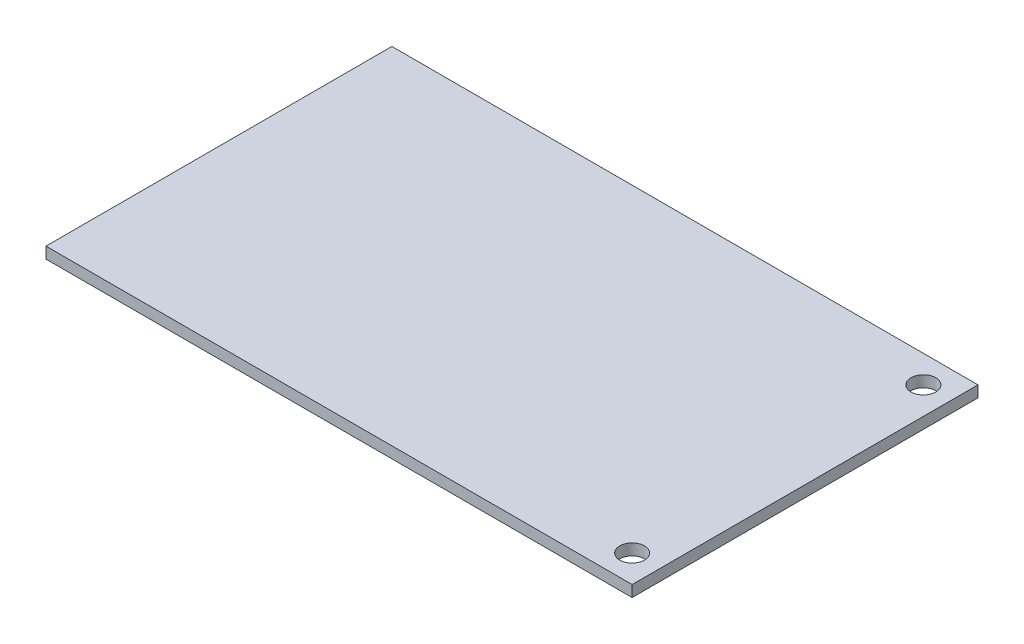
ISO-10303-21;
HEADER;
FILE_DESCRIPTION(('STEP AP214'),'2;1');
FILE_NAME('part.step','',(''),(''),'','','');
FILE_SCHEMA(('AUTOMOTIVE_DESIGN { 1 0 10303 214 1 1 1 1 }'));
ENDSEC;
DATA;
#1=APPLICATION_CONTEXT('core data for automotive mechanical design processes');
#2=APPLICATION_PROTOCOL_DEFINITION('international standard','automotive_design',2000,#1);
#3=PRODUCT_CONTEXT('',#1,'mechanical');
#4=PRODUCT('Part','Part','',(#3));
#5=PRODUCT_RELATED_PRODUCT_CATEGORY('part','',(#4));
#6=PRODUCT_DEFINITION_FORMATION('','',#4);
#7=PRODUCT_DEFINITION_CONTEXT('part definition',#1,'design');
#8=PRODUCT_DEFINITION('design','',#6,#7);
#9=PRODUCT_DEFINITION_SHAPE('','',#8);
#10=(LENGTH_UNIT() NAMED_UNIT(*) SI_UNIT(.MILLI.,.METRE.));
#11=(NAMED_UNIT(*) PLANE_ANGLE_UNIT() SI_UNIT($,.RADIAN.));
#12=(NAMED_UNIT(*) SI_UNIT($,.STERADIAN.) SOLID_ANGLE_UNIT());
#13=UNCERTAINTY_MEASURE_WITH_UNIT(LENGTH_MEASURE(1.E-05),#10,'distance_accuracy_value','');
#14=(GEOMETRIC_REPRESENTATION_CONTEXT(3) GLOBAL_UNCERTAINTY_ASSIGNED_CONTEXT((#13)) GLOBAL_UNIT_ASSIGNED_CONTEXT((#10,
#11,#12)) REPRESENTATION_CONTEXT('',''));
#15=CARTESIAN_POINT('',(0.,0.,0.));
#16=DIRECTION('',(0.,0.,1.));
#17=DIRECTION('',(1.,0.,0.));
#18=AXIS2_PLACEMENT_3D('',#15,#16,#17);
#19=CARTESIAN_POINT('',(0.,1.5748,0.));
#20=DIRECTION('',(0.,1.,0.));
#21=DIRECTION('',(0.,0.,1.));
#22=AXIS2_PLACEMENT_3D('',#19,#20,#21);
#23=PLANE('',#22);
#24=CARTESIAN_POINT('',(37.084,1.5748,-20.32));
#25=DIRECTION('',(0.,1.,0.));
#26=DIRECTION('',(0.,0.,1.));
#27=AXIS2_PLACEMENT_3D('',#24,#25,#26);
#28=CIRCLE('',#27,1.7272);
#29=CARTESIAN_POINT('',(37.084,1.5748,-18.5928));
#30=VERTEX_POINT('',#29);
#31=EDGE_CURVE('E100',#30,#30,#28,.T.);
#32=ORIENTED_EDGE('',*,*,#31,.F.);
#33=EDGE_LOOP('',(#32));
#34=FACE_BOUND('',#33,.T.);
#35=DIRECTION('',(0.,0.,1.));
#36=VECTOR('',#35,1.);
#37=CARTESIAN_POINT('',(-40.894,1.5748,24.13));
#38=LINE('',#37,#36);
#39=CARTESIAN_POINT('',(-40.894,1.5748,-24.13));
#40=VERTEX_POINT('',#39);
#41=CARTESIAN_POINT('',(-40.894,1.5748,24.13));
#42=VERTEX_POINT('',#41);
#43=EDGE_CURVE('E85',#40,#42,#38,.T.);
#44=ORIENTED_EDGE('',*,*,#43,.T.);
#45=DIRECTION('',(1.,0.,0.));
#46=VECTOR('',#45,1.);
#47=CARTESIAN_POINT('',(40.894,1.5748,24.13));
#48=LINE('',#47,#46);
#49=CARTESIAN_POINT('',(40.894,1.5748,24.13));
#50=VERTEX_POINT('',#49);
#51=EDGE_CURVE('E80',#42,#50,#48,.T.);
#52=ORIENTED_EDGE('',*,*,#51,.T.);
#53=DIRECTION('',(0.,0.,-1.));
#54=VECTOR('',#53,1.);
#55=CARTESIAN_POINT('',(40.894,1.5748,24.13));
#56=LINE('',#55,#54);
#57=CARTESIAN_POINT('',(40.894,1.5748,-24.13));
#58=VERTEX_POINT('',#57);
#59=EDGE_CURVE('E83',#50,#58,#56,.T.);
#60=ORIENTED_EDGE('',*,*,#59,.T.);
#61=DIRECTION('',(-1.,0.,0.));
#62=VECTOR('',#61,1.);
#63=CARTESIAN_POINT('',(40.894,1.5748,-24.13));
#64=LINE('',#63,#62);
#65=EDGE_CURVE('E50',#58,#40,#64,.T.);
#66=ORIENTED_EDGE('',*,*,#65,.T.);
#67=EDGE_LOOP('',(#44,#52,#60,#66));
#68=FACE_BOUND('',#67,.T.);
#69=CARTESIAN_POINT('',(37.084,1.5748,20.32));
#70=DIRECTION('',(0.,1.,0.));
#71=DIRECTION('',(0.,0.,-1.));
#72=AXIS2_PLACEMENT_3D('',#69,#70,#71);
#73=CIRCLE('',#72,1.7272);
#74=CARTESIAN_POINT('',(37.084,1.5748,18.5928));
#75=VERTEX_POINT('',#74);
#76=EDGE_CURVE('E115',#75,#75,#73,.T.);
#77=ORIENTED_EDGE('',*,*,#76,.F.);
#78=EDGE_LOOP('',(#77));
#79=FACE_BOUND('',#78,.T.);
#80=ADVANCED_FACE('F33',(#34,#68,#79),#23,.T.);
#81=CARTESIAN_POINT('',(0.,0.,0.));
#82=DIRECTION('',(0.,1.,0.));
#83=DIRECTION('',(0.,0.,1.));
#84=AXIS2_PLACEMENT_3D('',#81,#82,#83);
#85=PLANE('',#84);
#86=DIRECTION('',(0.,0.,1.));
#87=VECTOR('',#86,1.);
#88=CARTESIAN_POINT('',(-40.894,0.,24.13));
#89=LINE('',#88,#87);
#90=CARTESIAN_POINT('',(-40.894,0.,-24.13));
#91=VERTEX_POINT('',#90);
#92=CARTESIAN_POINT('',(-40.894,0.,24.13));
#93=VERTEX_POINT('',#92);
#94=EDGE_CURVE('E97',#91,#93,#89,.T.);
#95=ORIENTED_EDGE('',*,*,#94,.F.);
#96=DIRECTION('',(-1.,0.,0.));
#97=VECTOR('',#96,1.);
#98=CARTESIAN_POINT('',(40.894,0.,-24.13));
#99=LINE('',#98,#97);
#100=CARTESIAN_POINT('',(40.894,0.,-24.13));
#101=VERTEX_POINT('',#100);
#102=EDGE_CURVE('E73',#101,#91,#99,.T.);
#103=ORIENTED_EDGE('',*,*,#102,.F.);
#104=DIRECTION('',(0.,0.,-1.));
#105=VECTOR('',#104,1.);
#106=CARTESIAN_POINT('',(40.894,0.,24.13));
#107=LINE('',#106,#105);
#108=CARTESIAN_POINT('',(40.894,0.,24.13));
#109=VERTEX_POINT('',#108);
#110=EDGE_CURVE('E67',#109,#101,#107,.T.);
#111=ORIENTED_EDGE('',*,*,#110,.F.);
#112=DIRECTION('',(1.,0.,0.));
#113=VECTOR('',#112,1.);
#114=CARTESIAN_POINT('',(40.894,0.,24.13));
#115=LINE('',#114,#113);
#116=EDGE_CURVE('E89',#93,#109,#115,.T.);
#117=ORIENTED_EDGE('',*,*,#116,.F.);
#118=EDGE_LOOP('',(#95,#103,#111,#117));
#119=FACE_BOUND('',#118,.T.);
#120=CARTESIAN_POINT('',(37.084,0.,-20.32));
#121=DIRECTION('',(0.,1.,0.));
#122=DIRECTION('',(0.,0.,1.));
#123=AXIS2_PLACEMENT_3D('',#120,#121,#122);
#124=CIRCLE('',#123,1.7272);
#125=CARTESIAN_POINT('',(37.084,0.,-18.5928));
#126=VERTEX_POINT('',#125);
#127=EDGE_CURVE('E112',#126,#126,#124,.T.);
#128=ORIENTED_EDGE('',*,*,#127,.T.);
#129=EDGE_LOOP('',(#128));
#130=FACE_BOUND('',#129,.T.);
#131=CARTESIAN_POINT('',(37.084,0.,20.32));
#132=DIRECTION('',(0.,1.,0.));
#133=DIRECTION('',(0.,0.,-1.));
#134=AXIS2_PLACEMENT_3D('',#131,#132,#133);
#135=CIRCLE('',#134,1.7272);
#136=CARTESIAN_POINT('',(37.084,0.,18.5928));
#137=VERTEX_POINT('',#136);
#138=EDGE_CURVE('E118',#137,#137,#135,.T.);
#139=ORIENTED_EDGE('',*,*,#138,.T.);
#140=EDGE_LOOP('',(#139));
#141=FACE_BOUND('',#140,.T.);
#142=ADVANCED_FACE('F108',(#119,#130,#141),#85,.F.);
#143=CARTESIAN_POINT('',(-40.894,1.5748,24.13));
#144=DIRECTION('',(1.,0.,0.));
#145=DIRECTION('',(0.,0.,-1.));
#146=AXIS2_PLACEMENT_3D('',#143,#144,#145);
#147=PLANE('',#146);
#148=ORIENTED_EDGE('',*,*,#94,.T.);
#149=DIRECTION('',(0.,-1.,0.));
#150=VECTOR('',#149,1.);
#151=CARTESIAN_POINT('',(-40.894,1.5748,24.13));
#152=LINE('',#151,#150);
#153=EDGE_CURVE('E11',#42,#93,#152,.T.);
#154=ORIENTED_EDGE('',*,*,#153,.F.);
#155=ORIENTED_EDGE('',*,*,#43,.F.);
#156=DIRECTION('',(0.,-1.,0.));
#157=VECTOR('',#156,1.);
#158=CARTESIAN_POINT('',(-40.894,1.5748,-24.13));
#159=LINE('',#158,#157);
#160=EDGE_CURVE('E93',#40,#91,#159,.T.);
#161=ORIENTED_EDGE('',*,*,#160,.T.);
#162=EDGE_LOOP('',(#148,#154,#155,#161));
#163=FACE_BOUND('',#162,.T.);
#164=ADVANCED_FACE('F35',(#163),#147,.F.);
#165=CARTESIAN_POINT('',(40.894,1.5748,24.13));
#166=DIRECTION('',(0.,0.,-1.));
#167=DIRECTION('',(-1.,0.,0.));
#168=AXIS2_PLACEMENT_3D('',#165,#166,#167);
#169=PLANE('',#168);
#170=ORIENTED_EDGE('',*,*,#116,.T.);
#171=DIRECTION('',(0.,-1.,0.));
#172=VECTOR('',#171,1.);
#173=CARTESIAN_POINT('',(40.894,1.5748,24.13));
#174=LINE('',#173,#172);
#175=EDGE_CURVE('E42',#50,#109,#174,.T.);
#176=ORIENTED_EDGE('',*,*,#175,.F.);
#177=ORIENTED_EDGE('',*,*,#51,.F.);
#178=ORIENTED_EDGE('',*,*,#153,.T.);
#179=EDGE_LOOP('',(#170,#176,#177,#178));
#180=FACE_BOUND('',#179,.T.);
#181=ADVANCED_FACE('F88',(#180),#169,.F.);
#182=CARTESIAN_POINT('',(40.894,1.5748,24.13));
#183=DIRECTION('',(-1.,0.,0.));
#184=DIRECTION('',(0.,0.,1.));
#185=AXIS2_PLACEMENT_3D('',#182,#183,#184);
#186=PLANE('',#185);
#187=ORIENTED_EDGE('',*,*,#110,.T.);
#188=DIRECTION('',(0.,-1.,0.));
#189=VECTOR('',#188,1.);
#190=CARTESIAN_POINT('',(40.894,1.5748,-24.13));
#191=LINE('',#190,#189);
#192=EDGE_CURVE('E90',#58,#101,#191,.T.);
#193=ORIENTED_EDGE('',*,*,#192,.F.);
#194=ORIENTED_EDGE('',*,*,#59,.F.);
#195=ORIENTED_EDGE('',*,*,#175,.T.);
#196=EDGE_LOOP('',(#187,#193,#194,#195));
#197=FACE_BOUND('',#196,.T.);
#198=ADVANCED_FACE('F91',(#197),#186,.F.);
#199=CARTESIAN_POINT('',(40.894,1.5748,-24.13));
#200=DIRECTION('',(0.,0.,1.));
#201=DIRECTION('',(1.,0.,0.));
#202=AXIS2_PLACEMENT_3D('',#199,#200,#201);
#203=PLANE('',#202);
#204=ORIENTED_EDGE('',*,*,#102,.T.);
#205=ORIENTED_EDGE('',*,*,#160,.F.);
#206=ORIENTED_EDGE('',*,*,#65,.F.);
#207=ORIENTED_EDGE('',*,*,#192,.T.);
#208=EDGE_LOOP('',(#204,#205,#206,#207));
#209=FACE_BOUND('',#208,.T.);
#210=ADVANCED_FACE('F105',(#209),#203,.F.);
#211=CARTESIAN_POINT('',(37.084,1.5748,-20.32));
#212=DIRECTION('',(0.,-1.,0.));
#213=DIRECTION('',(0.,0.,-1.));
#214=AXIS2_PLACEMENT_3D('',#211,#212,#213);
#215=CYLINDRICAL_SURFACE('',#214,1.7272);
#216=ORIENTED_EDGE('',*,*,#31,.T.);
#217=EDGE_LOOP('',(#216));
#218=FACE_BOUND('',#217,.T.);
#219=ORIENTED_EDGE('',*,*,#127,.F.);
#220=EDGE_LOOP('',(#219));
#221=FACE_BOUND('',#220,.T.);
#222=ADVANCED_FACE('F135',(#218,#221),#215,.F.);
#223=CARTESIAN_POINT('',(37.084,1.5748,20.32));
#224=DIRECTION('',(0.,-1.,0.));
#225=DIRECTION('',(0.,0.,-1.));
#226=AXIS2_PLACEMENT_3D('',#223,#224,#225);
#227=CYLINDRICAL_SURFACE('',#226,1.7272);
#228=ORIENTED_EDGE('',*,*,#76,.T.);
#229=EDGE_LOOP('',(#228));
#230=FACE_BOUND('',#229,.T.);
#231=ORIENTED_EDGE('',*,*,#138,.F.);
#232=EDGE_LOOP('',(#231));
#233=FACE_BOUND('',#232,.T.);
#234=ADVANCED_FACE('F124',(#230,#233),#227,.F.);
#235=CLOSED_SHELL('',(#80,#142,#164,#181,#198,#210,#222,#234));
#236=MANIFOLD_SOLID_BREP('B2',#235);
#237=ADVANCED_BREP_SHAPE_REPRESENTATION('',(#18,#236),#14);
#238=SHAPE_DEFINITION_REPRESENTATION(#9,#237);
ENDSEC;
END-ISO-10303-21;
